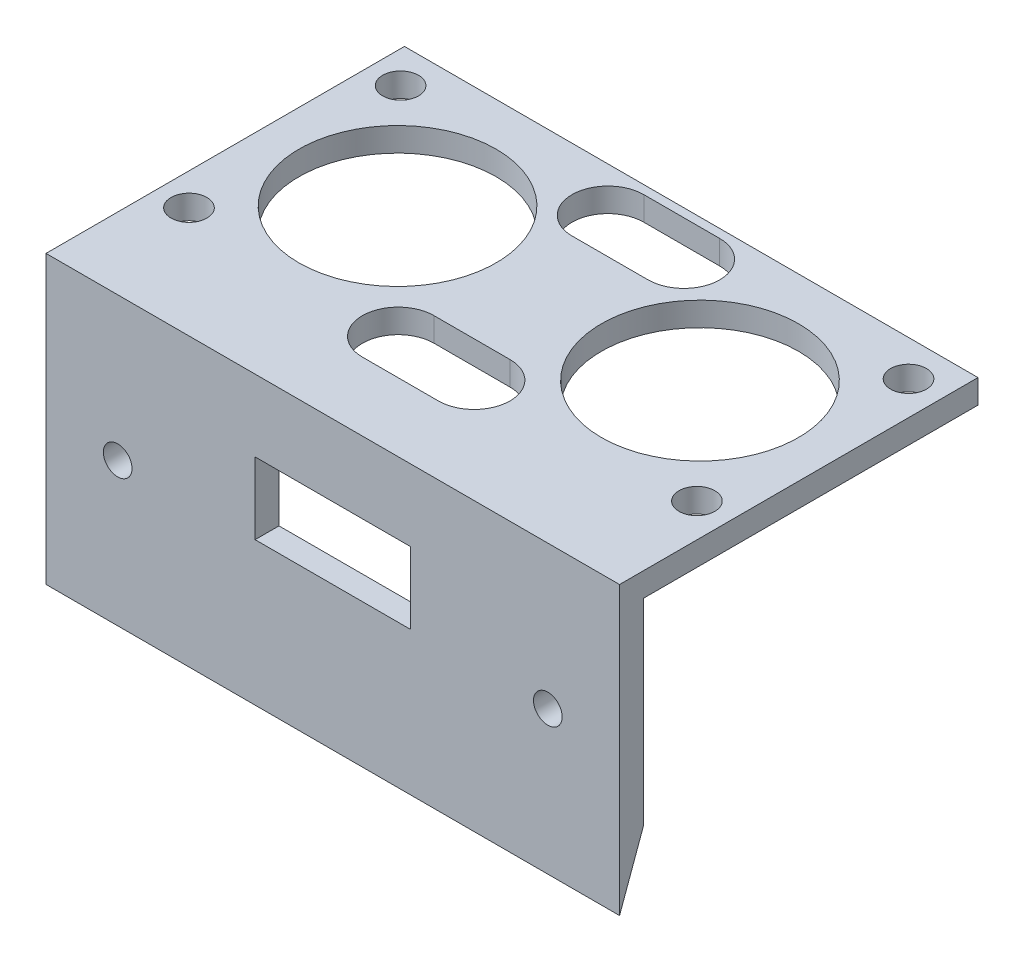
ISO-10303-21;
HEADER;
FILE_DESCRIPTION(('STEP AP214'),'2;1');
FILE_NAME('part.step','',(''),(''),'','','');
FILE_SCHEMA(('AUTOMOTIVE_DESIGN { 1 0 10303 214 1 1 1 1 }'));
ENDSEC;
DATA;
#1=APPLICATION_CONTEXT('core data for automotive mechanical design processes');
#2=APPLICATION_PROTOCOL_DEFINITION('international standard','automotive_design',2000,#1);
#3=PRODUCT_CONTEXT('',#1,'mechanical');
#4=PRODUCT('Part','Part','',(#3));
#5=PRODUCT_RELATED_PRODUCT_CATEGORY('part','',(#4));
#6=PRODUCT_DEFINITION_FORMATION('','',#4);
#7=PRODUCT_DEFINITION_CONTEXT('part definition',#1,'design');
#8=PRODUCT_DEFINITION('design','',#6,#7);
#9=PRODUCT_DEFINITION_SHAPE('','',#8);
#10=(LENGTH_UNIT() NAMED_UNIT(*) SI_UNIT(.MILLI.,.METRE.));
#11=(NAMED_UNIT(*) PLANE_ANGLE_UNIT() SI_UNIT($,.RADIAN.));
#12=(NAMED_UNIT(*) SI_UNIT($,.STERADIAN.) SOLID_ANGLE_UNIT());
#13=UNCERTAINTY_MEASURE_WITH_UNIT(LENGTH_MEASURE(1.E-05),#10,'distance_accuracy_value','');
#14=(GEOMETRIC_REPRESENTATION_CONTEXT(3) GLOBAL_UNCERTAINTY_ASSIGNED_CONTEXT((#13)) GLOBAL_UNIT_ASSIGNED_CONTEXT((#10,
#11,#12)) REPRESENTATION_CONTEXT('',''));
#15=CARTESIAN_POINT('',(0.,0.,0.));
#16=DIRECTION('',(0.,0.,1.));
#17=DIRECTION('',(1.,0.,0.));
#18=AXIS2_PLACEMENT_3D('',#15,#16,#17);
#19=CARTESIAN_POINT('',(42.1597413184278,21.2667271603729,10.8193745932419));
#20=DIRECTION('',(0.,0.,-1.));
#21=DIRECTION('',(-1.,0.,0.));
#22=AXIS2_PLACEMENT_3D('',#19,#20,#21);
#23=PLANE('',#22);
#24=DIRECTION('',(-1.,0.,0.));
#25=VECTOR('',#24,1.);
#26=CARTESIAN_POINT('',(42.1597413184278,23.2667271603729,10.8193745932419));
#27=LINE('',#26,#25);
#28=CARTESIAN_POINT('',(42.1597413184278,23.2667271603729,10.8193745932419));
#29=VERTEX_POINT('',#28);
#30=CARTESIAN_POINT('',(-5.84025868157225,23.2667271603729,10.8193745932419));
#31=VERTEX_POINT('',#30);
#32=EDGE_CURVE('E464',#29,#31,#27,.T.);
#33=ORIENTED_EDGE('',*,*,#32,.F.);
#34=DIRECTION('',(0.,1.,0.));
#35=VECTOR('',#34,1.);
#36=CARTESIAN_POINT('',(42.1597413184278,21.2667271603729,10.8193745932419));
#37=LINE('',#36,#35);
#38=CARTESIAN_POINT('',(42.1597413184278,21.2667271603729,10.8193745932419));
#39=VERTEX_POINT('',#38);
#40=EDGE_CURVE('E496',#39,#29,#37,.T.);
#41=ORIENTED_EDGE('',*,*,#40,.F.);
#42=DIRECTION('',(-1.,0.,0.));
#43=VECTOR('',#42,1.);
#44=CARTESIAN_POINT('',(42.1597413184278,21.2667271603729,10.8193745932419));
#45=LINE('',#44,#43);
#46=CARTESIAN_POINT('',(-5.84025868157225,21.2667271603729,10.8193745932419));
#47=VERTEX_POINT('',#46);
#48=EDGE_CURVE('E474',#39,#47,#45,.T.);
#49=ORIENTED_EDGE('',*,*,#48,.T.);
#50=DIRECTION('',(0.,1.,0.));
#51=VECTOR('',#50,1.);
#52=CARTESIAN_POINT('',(-5.84025868157225,21.2667271603729,10.8193745932419));
#53=LINE('',#52,#51);
#54=EDGE_CURVE('E486',#47,#31,#53,.T.);
#55=ORIENTED_EDGE('',*,*,#54,.T.);
#56=EDGE_LOOP('',(#33,#41,#49,#55));
#57=FACE_BOUND('',#56,.T.);
#58=ADVANCED_FACE('F41',(#57),#23,.T.);
#59=CARTESIAN_POINT('',(42.1597413184278,21.2667271603729,35.8193745932419));
#60=DIRECTION('',(1.,0.,0.));
#61=DIRECTION('',(0.,0.,-1.));
#62=AXIS2_PLACEMENT_3D('',#59,#60,#61);
#63=PLANE('',#62);
#64=DIRECTION('',(0.,-1.,0.));
#65=VECTOR('',#64,1.);
#66=CARTESIAN_POINT('',(42.1597413184278,71.5264412084275,40.8193745932419));
#67=LINE('',#66,#65);
#68=CARTESIAN_POINT('',(42.1597413184278,23.2667271603729,40.8193745932419));
#69=VERTEX_POINT('',#68);
#70=CARTESIAN_POINT('',(42.1597413184278,-0.728227678536239,40.8193745932419));
#71=VERTEX_POINT('',#70);
#72=EDGE_CURVE('E334',#69,#71,#67,.T.);
#73=ORIENTED_EDGE('',*,*,#72,.T.);
#74=DIRECTION('',(0.,-0.939692620785906,0.342020143325675));
#75=VECTOR('',#74,1.);
#76=CARTESIAN_POINT('',(42.1597413184278,20.3007752306342,33.1654434780063));
#77=LINE('',#76,#75);
#78=CARTESIAN_POINT('',(42.1597413184278,4.76672716037289,38.8193745932419));
#79=VERTEX_POINT('',#78);
#80=EDGE_CURVE('E64',#71,#79,#77,.F.);
#81=ORIENTED_EDGE('',*,*,#80,.T.);
#82=DIRECTION('',(0.,1.,0.));
#83=VECTOR('',#82,1.);
#84=CARTESIAN_POINT('',(42.1597413184278,21.2667271603729,38.8193745932419));
#85=LINE('',#84,#83);
#86=CARTESIAN_POINT('',(42.1597413184278,21.2667271603729,38.8193745932419));
#87=VERTEX_POINT('',#86);
#88=EDGE_CURVE('E311',#79,#87,#85,.T.);
#89=ORIENTED_EDGE('',*,*,#88,.T.);
#90=DIRECTION('',(0.,0.,-1.));
#91=VECTOR('',#90,1.);
#92=CARTESIAN_POINT('',(42.1597413184278,21.2667271603729,35.8193745932419));
#93=LINE('',#92,#91);
#94=EDGE_CURVE('E483',#87,#39,#93,.T.);
#95=ORIENTED_EDGE('',*,*,#94,.T.);
#96=ORIENTED_EDGE('',*,*,#40,.T.);
#97=DIRECTION('',(0.,0.,-1.));
#98=VECTOR('',#97,1.);
#99=CARTESIAN_POINT('',(42.1597413184278,23.2667271603729,35.8193745932419));
#100=LINE('',#99,#98);
#101=EDGE_CURVE('E479',#69,#29,#100,.T.);
#102=ORIENTED_EDGE('',*,*,#101,.F.);
#103=EDGE_LOOP('',(#73,#81,#89,#95,#96,#102));
#104=FACE_BOUND('',#103,.T.);
#105=ADVANCED_FACE('F535',(#104),#63,.T.);
#106=CARTESIAN_POINT('',(-5.84025868157225,21.2667271603729,10.8193745932419));
#107=DIRECTION('',(-1.,0.,0.));
#108=DIRECTION('',(0.,0.,1.));
#109=AXIS2_PLACEMENT_3D('',#106,#107,#108);
#110=PLANE('',#109);
#111=DIRECTION('',(0.,-1.,0.));
#112=VECTOR('',#111,1.);
#113=CARTESIAN_POINT('',(-5.84025868157224,21.2667271603729,38.8193745932419));
#114=LINE('',#113,#112);
#115=CARTESIAN_POINT('',(-5.84025868157224,21.2667271603729,38.8193745932419));
#116=VERTEX_POINT('',#115);
#117=CARTESIAN_POINT('',(-5.84025868157223,4.76672716037289,38.8193745932419));
#118=VERTEX_POINT('',#117);
#119=EDGE_CURVE('E321',#116,#118,#114,.T.);
#120=ORIENTED_EDGE('',*,*,#119,.T.);
#121=DIRECTION('',(0.,0.939692620785906,-0.342020143325675));
#122=VECTOR('',#121,1.);
#123=CARTESIAN_POINT('',(-5.84025868157225,28.3356203517161,30.2409990169934));
#124=LINE('',#123,#122);
#125=CARTESIAN_POINT('',(-5.84025868157223,-0.728227678536239,40.8193745932419));
#126=VERTEX_POINT('',#125);
#127=EDGE_CURVE('E11',#118,#126,#124,.F.);
#128=ORIENTED_EDGE('',*,*,#127,.T.);
#129=DIRECTION('',(0.,-1.,0.));
#130=VECTOR('',#129,1.);
#131=CARTESIAN_POINT('',(-5.84025868157223,71.5264412084275,40.8193745932419));
#132=LINE('',#131,#130);
#133=CARTESIAN_POINT('',(-5.84025868157223,23.2667271603729,40.8193745932419));
#134=VERTEX_POINT('',#133);
#135=EDGE_CURVE('E330',#134,#126,#132,.T.);
#136=ORIENTED_EDGE('',*,*,#135,.F.);
#137=DIRECTION('',(0.,0.,1.));
#138=VECTOR('',#137,1.);
#139=CARTESIAN_POINT('',(-5.84025868157225,23.2667271603729,10.8193745932419));
#140=LINE('',#139,#138);
#141=EDGE_CURVE('E490',#31,#134,#140,.T.);
#142=ORIENTED_EDGE('',*,*,#141,.F.);
#143=ORIENTED_EDGE('',*,*,#54,.F.);
#144=DIRECTION('',(0.,0.,1.));
#145=VECTOR('',#144,1.);
#146=CARTESIAN_POINT('',(-5.84025868157225,21.2667271603729,10.8193745932419));
#147=LINE('',#146,#145);
#148=EDGE_CURVE('E478',#47,#116,#147,.T.);
#149=ORIENTED_EDGE('',*,*,#148,.T.);
#150=EDGE_LOOP('',(#120,#128,#136,#142,#143,#149));
#151=FACE_BOUND('',#150,.T.);
#152=ADVANCED_FACE('F523',(#151),#110,.T.);
#153=CARTESIAN_POINT('',(0.,21.2667271603729,0.));
#154=DIRECTION('',(0.,1.,0.));
#155=DIRECTION('',(0.,0.,1.));
#156=AXIS2_PLACEMENT_3D('',#153,#154,#155);
#157=PLANE('',#156);
#158=CARTESIAN_POINT('',(-3.16384489409427,21.2667271603729,31.5293745932419));
#159=DIRECTION('',(0.,1.,0.));
#160=DIRECTION('',(0.,0.,-1.));
#161=AXIS2_PLACEMENT_3D('',#158,#159,#160);
#162=CIRCLE('',#161,1.5);
#163=CARTESIAN_POINT('',(-3.16384489409427,21.2667271603729,30.0293745932419));
#164=VERTEX_POINT('',#163);
#165=EDGE_CURVE('E338',#164,#164,#162,.T.);
#166=ORIENTED_EDGE('',*,*,#165,.T.);
#167=EDGE_LOOP('',(#166));
#168=FACE_BOUND('',#167,.T.);
#169=CARTESIAN_POINT('',(-3.16384489409427,21.2667271603729,13.8193745932419));
#170=DIRECTION('',(0.,1.,0.));
#171=DIRECTION('',(0.,0.,-1.));
#172=AXIS2_PLACEMENT_3D('',#169,#170,#171);
#173=CIRCLE('',#172,1.5);
#174=CARTESIAN_POINT('',(-3.16384489409427,21.2667271603729,12.3193745932419));
#175=VERTEX_POINT('',#174);
#176=EDGE_CURVE('E346',#175,#175,#173,.T.);
#177=ORIENTED_EDGE('',*,*,#176,.T.);
#178=EDGE_LOOP('',(#177));
#179=FACE_BOUND('',#178,.T.);
#180=CARTESIAN_POINT('',(39.3461551059057,21.2667271603729,13.8193745932419));
#181=DIRECTION('',(0.,1.,0.));
#182=DIRECTION('',(0.,0.,-1.));
#183=AXIS2_PLACEMENT_3D('',#180,#181,#182);
#184=CIRCLE('',#183,1.5);
#185=CARTESIAN_POINT('',(39.3461551059057,21.2667271603729,12.3193745932419));
#186=VERTEX_POINT('',#185);
#187=EDGE_CURVE('E354',#186,#186,#184,.T.);
#188=ORIENTED_EDGE('',*,*,#187,.T.);
#189=EDGE_LOOP('',(#188));
#190=FACE_BOUND('',#189,.T.);
#191=CARTESIAN_POINT('',(39.3461551059057,21.2667271603729,31.5293745932419));
#192=DIRECTION('',(0.,1.,0.));
#193=DIRECTION('',(0.,0.,-1.));
#194=AXIS2_PLACEMENT_3D('',#191,#192,#193);
#195=CIRCLE('',#194,1.5);
#196=CARTESIAN_POINT('',(39.3461551059057,21.2667271603729,30.0293745932419));
#197=VERTEX_POINT('',#196);
#198=EDGE_CURVE('E362',#197,#197,#195,.T.);
#199=ORIENTED_EDGE('',*,*,#198,.T.);
#200=EDGE_LOOP('',(#199));
#201=FACE_BOUND('',#200,.T.);
#202=CARTESIAN_POINT('',(30.7461551059057,21.2667271603729,22.6743745932419));
#203=DIRECTION('',(0.,1.,0.));
#204=DIRECTION('',(0.,0.,-1.));
#205=AXIS2_PLACEMENT_3D('',#202,#203,#204);
#206=CIRCLE('',#205,8.25);
#207=CARTESIAN_POINT('',(30.7461551059057,21.2667271603729,14.4243745932419));
#208=VERTEX_POINT('',#207);
#209=EDGE_CURVE('E370',#208,#208,#206,.T.);
#210=ORIENTED_EDGE('',*,*,#209,.T.);
#211=EDGE_LOOP('',(#210));
#212=FACE_BOUND('',#211,.T.);
#213=DIRECTION('',(-1.,0.,0.));
#214=VECTOR('',#213,1.);
#215=CARTESIAN_POINT('',(14.9111551059057,21.2667271603729,11.5443745888145));
#216=LINE('',#215,#214);
#217=CARTESIAN_POINT('',(21.2711551059057,21.2667271603729,11.5443745888145));
#218=VERTEX_POINT('',#217);
#219=CARTESIAN_POINT('',(14.9111551059057,21.2667271603729,11.5443745888145));
#220=VERTEX_POINT('',#219);
#221=EDGE_CURVE('E391',#218,#220,#216,.T.);
#222=ORIENTED_EDGE('',*,*,#221,.T.);
#223=CARTESIAN_POINT('',(14.9111551059057,21.2667271603729,14.5443745888145));
#224=DIRECTION('',(0.,1.,0.));
#225=DIRECTION('',(0.,0.,-1.));
#226=AXIS2_PLACEMENT_3D('',#223,#224,#225);
#227=CIRCLE('',#226,3.);
#228=CARTESIAN_POINT('',(14.9111551059057,21.2667271603729,17.5443745888145));
#229=VERTEX_POINT('',#228);
#230=EDGE_CURVE('E378',#220,#229,#227,.T.);
#231=ORIENTED_EDGE('',*,*,#230,.T.);
#232=DIRECTION('',(1.,0.,0.));
#233=VECTOR('',#232,1.);
#234=CARTESIAN_POINT('',(21.2711551059057,21.2667271603729,17.5443745888145));
#235=LINE('',#234,#233);
#236=CARTESIAN_POINT('',(21.2711551059057,21.2667271603729,17.5443745888145));
#237=VERTEX_POINT('',#236);
#238=EDGE_CURVE('E382',#229,#237,#235,.T.);
#239=ORIENTED_EDGE('',*,*,#238,.T.);
#240=CARTESIAN_POINT('',(21.2711551059057,21.2667271603729,14.5443745888145));
#241=DIRECTION('',(0.,1.,0.));
#242=DIRECTION('',(0.,0.,-1.));
#243=AXIS2_PLACEMENT_3D('',#240,#241,#242);
#244=CIRCLE('',#243,3.);
#245=EDGE_CURVE('E387',#237,#218,#244,.T.);
#246=ORIENTED_EDGE('',*,*,#245,.T.);
#247=EDGE_LOOP('',(#222,#231,#239,#246));
#248=FACE_BOUND('',#247,.T.);
#249=CARTESIAN_POINT('',(5.43615510590573,21.2667271603729,22.6743745932419));
#250=DIRECTION('',(0.,1.,0.));
#251=DIRECTION('',(0.,0.,-1.));
#252=AXIS2_PLACEMENT_3D('',#249,#250,#251);
#253=CIRCLE('',#252,8.25);
#254=CARTESIAN_POINT('',(5.43615510590573,21.2667271603729,14.4243745932419));
#255=VERTEX_POINT('',#254);
#256=EDGE_CURVE('E422',#255,#255,#253,.T.);
#257=ORIENTED_EDGE('',*,*,#256,.T.);
#258=EDGE_LOOP('',(#257));
#259=FACE_BOUND('',#258,.T.);
#260=DIRECTION('',(1.,0.,0.));
#261=VECTOR('',#260,1.);
#262=CARTESIAN_POINT('',(14.9111551059057,21.2667271603729,35.0943745976693));
#263=LINE('',#262,#261);
#264=CARTESIAN_POINT('',(14.9111551059057,21.2667271603729,35.0943745976693));
#265=VERTEX_POINT('',#264);
#266=CARTESIAN_POINT('',(21.2711551059057,21.2667271603729,35.0943745976693));
#267=VERTEX_POINT('',#266);
#268=EDGE_CURVE('E443',#265,#267,#263,.T.);
#269=ORIENTED_EDGE('',*,*,#268,.T.);
#270=CARTESIAN_POINT('',(21.2711551059057,21.2667271603729,32.0943745976693));
#271=DIRECTION('',(0.,1.,0.));
#272=DIRECTION('',(0.,0.,1.));
#273=AXIS2_PLACEMENT_3D('',#270,#271,#272);
#274=CIRCLE('',#273,3.);
#275=CARTESIAN_POINT('',(21.2711551059057,21.2667271603729,29.0943745976693));
#276=VERTEX_POINT('',#275);
#277=EDGE_CURVE('E430',#267,#276,#274,.T.);
#278=ORIENTED_EDGE('',*,*,#277,.T.);
#279=DIRECTION('',(-1.,0.,0.));
#280=VECTOR('',#279,1.);
#281=CARTESIAN_POINT('',(21.2711551059057,21.2667271603729,29.0943745976693));
#282=LINE('',#281,#280);
#283=CARTESIAN_POINT('',(14.9111551059057,21.2667271603729,29.0943745976693));
#284=VERTEX_POINT('',#283);
#285=EDGE_CURVE('E434',#276,#284,#282,.T.);
#286=ORIENTED_EDGE('',*,*,#285,.T.);
#287=CARTESIAN_POINT('',(14.9111551059057,21.2667271603729,32.0943745976693));
#288=DIRECTION('',(0.,1.,0.));
#289=DIRECTION('',(0.,0.,1.));
#290=AXIS2_PLACEMENT_3D('',#287,#288,#289);
#291=CIRCLE('',#290,3.);
#292=EDGE_CURVE('E439',#284,#265,#291,.T.);
#293=ORIENTED_EDGE('',*,*,#292,.T.);
#294=EDGE_LOOP('',(#269,#278,#286,#293));
#295=FACE_BOUND('',#294,.T.);
#296=DIRECTION('',(-1.,0.,0.));
#297=VECTOR('',#296,1.);
#298=CARTESIAN_POINT('',(42.1597413184278,21.2667271603729,38.8193745932419));
#299=LINE('',#298,#297);
#300=CARTESIAN_POINT('',(30.6597413184277,21.2667271603729,38.8193745932419));
#301=VERTEX_POINT('',#300);
#302=CARTESIAN_POINT('',(5.65974131842772,21.2667271603729,38.8193745932419));
#303=VERTEX_POINT('',#302);
#304=EDGE_CURVE('E322',#301,#303,#299,.T.);
#305=ORIENTED_EDGE('',*,*,#304,.T.);
#306=DIRECTION('',(0.,0.,1.));
#307=VECTOR('',#306,1.);
#308=CARTESIAN_POINT('',(5.65974131842772,21.2667271603729,38.8193745932419));
#309=LINE('',#308,#307);
#310=CARTESIAN_POINT('',(5.65974131842772,21.2667271603729,34.8193745932419));
#311=VERTEX_POINT('',#310);
#312=EDGE_CURVE('E273',#311,#303,#309,.T.);
#313=ORIENTED_EDGE('',*,*,#312,.F.);
#314=DIRECTION('',(-1.,0.,0.));
#315=VECTOR('',#314,1.);
#316=CARTESIAN_POINT('',(5.65974131842772,21.2667271603729,34.8193745932419));
#317=LINE('',#316,#315);
#318=CARTESIAN_POINT('',(2.65974131842772,21.2667271603729,34.8193745932419));
#319=VERTEX_POINT('',#318);
#320=EDGE_CURVE('E277',#311,#319,#317,.T.);
#321=ORIENTED_EDGE('',*,*,#320,.T.);
#322=DIRECTION('',(0.,0.,1.));
#323=VECTOR('',#322,1.);
#324=CARTESIAN_POINT('',(2.65974131842772,21.2667271603729,38.8193745932419));
#325=LINE('',#324,#323);
#326=CARTESIAN_POINT('',(2.65974131842772,21.2667271603729,38.8193745932419));
#327=VERTEX_POINT('',#326);
#328=EDGE_CURVE('E263',#319,#327,#325,.T.);
#329=ORIENTED_EDGE('',*,*,#328,.T.);
#330=EDGE_CURVE('E316',#327,#116,#299,.T.);
#331=ORIENTED_EDGE('',*,*,#330,.T.);
#332=ORIENTED_EDGE('',*,*,#148,.F.);
#333=ORIENTED_EDGE('',*,*,#48,.F.);
#334=ORIENTED_EDGE('',*,*,#94,.F.);
#335=CARTESIAN_POINT('',(33.6597413184277,21.2667271603729,38.8193745932419));
#336=VERTEX_POINT('',#335);
#337=EDGE_CURVE('E317',#87,#336,#299,.T.);
#338=ORIENTED_EDGE('',*,*,#337,.T.);
#339=DIRECTION('',(0.,0.,1.));
#340=VECTOR('',#339,1.);
#341=CARTESIAN_POINT('',(33.6597413184277,21.2667271603729,38.8193745932419));
#342=LINE('',#341,#340);
#343=CARTESIAN_POINT('',(33.6597413184277,21.2667271603729,34.8193745932419));
#344=VERTEX_POINT('',#343);
#345=EDGE_CURVE('E288',#344,#336,#342,.T.);
#346=ORIENTED_EDGE('',*,*,#345,.F.);
#347=DIRECTION('',(1.,0.,0.));
#348=VECTOR('',#347,1.);
#349=CARTESIAN_POINT('',(30.6597413184277,21.2667271603729,34.8193745932419));
#350=LINE('',#349,#348);
#351=CARTESIAN_POINT('',(30.6597413184277,21.2667271603729,34.8193745932419));
#352=VERTEX_POINT('',#351);
#353=EDGE_CURVE('E306',#352,#344,#350,.T.);
#354=ORIENTED_EDGE('',*,*,#353,.F.);
#355=DIRECTION('',(0.,0.,1.));
#356=VECTOR('',#355,1.);
#357=CARTESIAN_POINT('',(30.6597413184277,21.2667271603729,38.8193745932419));
#358=LINE('',#357,#356);
#359=EDGE_CURVE('E298',#352,#301,#358,.T.);
#360=ORIENTED_EDGE('',*,*,#359,.T.);
#361=EDGE_LOOP('',(#305,#313,#321,#329,#331,#332,#333,#334,#338,#346,#354,#360));
#362=FACE_BOUND('',#361,.T.);
#363=ADVANCED_FACE('F530',(#168,#179,#190,#201,#212,#248,#259,#295,#362),#157,.F.);
#364=CARTESIAN_POINT('',(0.,23.2667271603729,0.));
#365=DIRECTION('',(0.,1.,0.));
#366=DIRECTION('',(0.,0.,1.));
#367=AXIS2_PLACEMENT_3D('',#364,#365,#366);
#368=PLANE('',#367);
#369=CARTESIAN_POINT('',(-3.16384489409427,23.2667271603729,31.5293745932419));
#370=DIRECTION('',(0.,1.,0.));
#371=DIRECTION('',(0.,0.,-1.));
#372=AXIS2_PLACEMENT_3D('',#369,#370,#371);
#373=CIRCLE('',#372,1.5);
#374=CARTESIAN_POINT('',(-3.16384489409427,23.2667271603729,30.0293745932419));
#375=VERTEX_POINT('',#374);
#376=EDGE_CURVE('E337',#375,#375,#373,.T.);
#377=ORIENTED_EDGE('',*,*,#376,.F.);
#378=EDGE_LOOP('',(#377));
#379=FACE_BOUND('',#378,.T.);
#380=CARTESIAN_POINT('',(-3.16384489409427,23.2667271603729,13.8193745932419));
#381=DIRECTION('',(0.,1.,0.));
#382=DIRECTION('',(0.,0.,-1.));
#383=AXIS2_PLACEMENT_3D('',#380,#381,#382);
#384=CIRCLE('',#383,1.5);
#385=CARTESIAN_POINT('',(-3.16384489409427,23.2667271603729,12.3193745932419));
#386=VERTEX_POINT('',#385);
#387=EDGE_CURVE('E342',#386,#386,#384,.T.);
#388=ORIENTED_EDGE('',*,*,#387,.F.);
#389=EDGE_LOOP('',(#388));
#390=FACE_BOUND('',#389,.T.);
#391=CARTESIAN_POINT('',(39.3461551059057,23.2667271603729,13.8193745932419));
#392=DIRECTION('',(0.,1.,0.));
#393=DIRECTION('',(0.,0.,-1.));
#394=AXIS2_PLACEMENT_3D('',#391,#392,#393);
#395=CIRCLE('',#394,1.5);
#396=CARTESIAN_POINT('',(39.3461551059057,23.2667271603729,12.3193745932419));
#397=VERTEX_POINT('',#396);
#398=EDGE_CURVE('E350',#397,#397,#395,.T.);
#399=ORIENTED_EDGE('',*,*,#398,.F.);
#400=EDGE_LOOP('',(#399));
#401=FACE_BOUND('',#400,.T.);
#402=CARTESIAN_POINT('',(39.3461551059057,23.2667271603729,31.5293745932419));
#403=DIRECTION('',(0.,1.,0.));
#404=DIRECTION('',(0.,0.,-1.));
#405=AXIS2_PLACEMENT_3D('',#402,#403,#404);
#406=CIRCLE('',#405,1.5);
#407=CARTESIAN_POINT('',(39.3461551059057,23.2667271603729,30.0293745932419));
#408=VERTEX_POINT('',#407);
#409=EDGE_CURVE('E358',#408,#408,#406,.T.);
#410=ORIENTED_EDGE('',*,*,#409,.F.);
#411=EDGE_LOOP('',(#410));
#412=FACE_BOUND('',#411,.T.);
#413=CARTESIAN_POINT('',(30.7461551059057,23.2667271603729,22.6743745932419));
#414=DIRECTION('',(0.,1.,0.));
#415=DIRECTION('',(0.,0.,-1.));
#416=AXIS2_PLACEMENT_3D('',#413,#414,#415);
#417=CIRCLE('',#416,8.25);
#418=CARTESIAN_POINT('',(30.7461551059057,23.2667271603729,14.4243745932419));
#419=VERTEX_POINT('',#418);
#420=EDGE_CURVE('E366',#419,#419,#417,.T.);
#421=ORIENTED_EDGE('',*,*,#420,.F.);
#422=EDGE_LOOP('',(#421));
#423=FACE_BOUND('',#422,.T.);
#424=CARTESIAN_POINT('',(14.9111551059057,23.2667271603729,14.5443745888145));
#425=DIRECTION('',(0.,1.,0.));
#426=DIRECTION('',(0.,0.,-1.));
#427=AXIS2_PLACEMENT_3D('',#424,#425,#426);
#428=CIRCLE('',#427,3.);
#429=CARTESIAN_POINT('',(14.9111551059057,23.2667271603729,11.5443745888145));
#430=VERTEX_POINT('',#429);
#431=CARTESIAN_POINT('',(14.9111551059057,23.2667271603729,17.5443745888145));
#432=VERTEX_POINT('',#431);
#433=EDGE_CURVE('E374',#430,#432,#428,.T.);
#434=ORIENTED_EDGE('',*,*,#433,.F.);
#435=DIRECTION('',(-1.,0.,0.));
#436=VECTOR('',#435,1.);
#437=CARTESIAN_POINT('',(14.9111551059057,23.2667271603729,11.5443745888145));
#438=LINE('',#437,#436);
#439=CARTESIAN_POINT('',(21.2711551059057,23.2667271603729,11.5443745888145));
#440=VERTEX_POINT('',#439);
#441=EDGE_CURVE('E383',#440,#430,#438,.T.);
#442=ORIENTED_EDGE('',*,*,#441,.F.);
#443=CARTESIAN_POINT('',(21.2711551059057,23.2667271603729,14.5443745888145));
#444=DIRECTION('',(0.,1.,0.));
#445=DIRECTION('',(0.,0.,-1.));
#446=AXIS2_PLACEMENT_3D('',#443,#444,#445);
#447=CIRCLE('',#446,3.);
#448=CARTESIAN_POINT('',(21.2711551059057,23.2667271603729,17.5443745888145));
#449=VERTEX_POINT('',#448);
#450=EDGE_CURVE('E402',#449,#440,#447,.T.);
#451=ORIENTED_EDGE('',*,*,#450,.F.);
#452=DIRECTION('',(1.,0.,0.));
#453=VECTOR('',#452,1.);
#454=CARTESIAN_POINT('',(21.2711551059057,23.2667271603729,17.5443745888145));
#455=LINE('',#454,#453);
#456=EDGE_CURVE('E398',#432,#449,#455,.T.);
#457=ORIENTED_EDGE('',*,*,#456,.F.);
#458=EDGE_LOOP('',(#434,#442,#451,#457));
#459=FACE_BOUND('',#458,.T.);
#460=CARTESIAN_POINT('',(5.43615510590573,23.2667271603729,22.6743745932419));
#461=DIRECTION('',(0.,1.,0.));
#462=DIRECTION('',(0.,0.,-1.));
#463=AXIS2_PLACEMENT_3D('',#460,#461,#462);
#464=CIRCLE('',#463,8.25);
#465=CARTESIAN_POINT('',(5.43615510590573,23.2667271603729,14.4243745932419));
#466=VERTEX_POINT('',#465);
#467=EDGE_CURVE('E412',#466,#466,#464,.T.);
#468=ORIENTED_EDGE('',*,*,#467,.F.);
#469=EDGE_LOOP('',(#468));
#470=FACE_BOUND('',#469,.T.);
#471=CARTESIAN_POINT('',(21.2711551059057,23.2667271603729,32.0943745976693));
#472=DIRECTION('',(0.,1.,0.));
#473=DIRECTION('',(0.,0.,1.));
#474=AXIS2_PLACEMENT_3D('',#471,#472,#473);
#475=CIRCLE('',#474,3.);
#476=CARTESIAN_POINT('',(21.2711551059057,23.2667271603729,35.0943745976693));
#477=VERTEX_POINT('',#476);
#478=CARTESIAN_POINT('',(21.2711551059057,23.2667271603729,29.0943745976693));
#479=VERTEX_POINT('',#478);
#480=EDGE_CURVE('E426',#477,#479,#475,.T.);
#481=ORIENTED_EDGE('',*,*,#480,.F.);
#482=DIRECTION('',(1.,0.,0.));
#483=VECTOR('',#482,1.);
#484=CARTESIAN_POINT('',(14.9111551059057,23.2667271603729,35.0943745976693));
#485=LINE('',#484,#483);
#486=CARTESIAN_POINT('',(14.9111551059057,23.2667271603729,35.0943745976693));
#487=VERTEX_POINT('',#486);
#488=EDGE_CURVE('E435',#487,#477,#485,.T.);
#489=ORIENTED_EDGE('',*,*,#488,.F.);
#490=CARTESIAN_POINT('',(14.9111551059057,23.2667271603729,32.0943745976693));
#491=DIRECTION('',(0.,1.,0.));
#492=DIRECTION('',(0.,0.,1.));
#493=AXIS2_PLACEMENT_3D('',#490,#491,#492);
#494=CIRCLE('',#493,3.);
#495=CARTESIAN_POINT('',(14.9111551059057,23.2667271603729,29.0943745976693));
#496=VERTEX_POINT('',#495);
#497=EDGE_CURVE('E454',#496,#487,#494,.T.);
#498=ORIENTED_EDGE('',*,*,#497,.F.);
#499=DIRECTION('',(-1.,0.,0.));
#500=VECTOR('',#499,1.);
#501=CARTESIAN_POINT('',(21.2711551059057,23.2667271603729,29.0943745976693));
#502=LINE('',#501,#500);
#503=EDGE_CURVE('E450',#479,#496,#502,.T.);
#504=ORIENTED_EDGE('',*,*,#503,.F.);
#505=EDGE_LOOP('',(#481,#489,#498,#504));
#506=FACE_BOUND('',#505,.T.);
#507=ORIENTED_EDGE('',*,*,#32,.T.);
#508=ORIENTED_EDGE('',*,*,#141,.T.);
#509=DIRECTION('',(-1.,0.,0.));
#510=VECTOR('',#509,1.);
#511=CARTESIAN_POINT('',(42.1597413184278,23.2667271603729,40.8193745932419));
#512=LINE('',#511,#510);
#513=EDGE_CURVE('E326',#69,#134,#512,.T.);
#514=ORIENTED_EDGE('',*,*,#513,.F.);
#515=ORIENTED_EDGE('',*,*,#101,.T.);
#516=EDGE_LOOP('',(#507,#508,#514,#515));
#517=FACE_BOUND('',#516,.T.);
#518=ADVANCED_FACE('F579',(#379,#390,#401,#412,#423,#459,#470,#506,#517),#368,.T.);
#519=CARTESIAN_POINT('',(21.2711551059057,21.2667271603729,32.0943745976693));
#520=DIRECTION('',(0.,1.,0.));
#521=DIRECTION('',(0.,0.,1.));
#522=AXIS2_PLACEMENT_3D('',#519,#520,#521);
#523=CYLINDRICAL_SURFACE('',#522,3.);
#524=ORIENTED_EDGE('',*,*,#480,.T.);
#525=DIRECTION('',(0.,1.,0.));
#526=VECTOR('',#525,1.);
#527=CARTESIAN_POINT('',(21.2711551059057,21.2667271603729,29.0943745976693));
#528=LINE('',#527,#526);
#529=EDGE_CURVE('E447',#276,#479,#528,.T.);
#530=ORIENTED_EDGE('',*,*,#529,.F.);
#531=ORIENTED_EDGE('',*,*,#277,.F.);
#532=DIRECTION('',(0.,1.,0.));
#533=VECTOR('',#532,1.);
#534=CARTESIAN_POINT('',(21.2711551059057,21.2667271603729,35.0943745976693));
#535=LINE('',#534,#533);
#536=EDGE_CURVE('E461',#267,#477,#535,.T.);
#537=ORIENTED_EDGE('',*,*,#536,.T.);
#538=EDGE_LOOP('',(#524,#530,#531,#537));
#539=FACE_BOUND('',#538,.T.);
#540=ADVANCED_FACE('F582',(#539),#523,.F.);
#541=CARTESIAN_POINT('',(14.9111551059057,21.2667271603729,35.0943745976693));
#542=DIRECTION('',(0.,0.,1.));
#543=DIRECTION('',(1.,0.,0.));
#544=AXIS2_PLACEMENT_3D('',#541,#542,#543);
#545=PLANE('',#544);
#546=ORIENTED_EDGE('',*,*,#488,.T.);
#547=ORIENTED_EDGE('',*,*,#536,.F.);
#548=ORIENTED_EDGE('',*,*,#268,.F.);
#549=DIRECTION('',(0.,1.,0.));
#550=VECTOR('',#549,1.);
#551=CARTESIAN_POINT('',(14.9111551059057,21.2667271603729,35.0943745976693));
#552=LINE('',#551,#550);
#553=EDGE_CURVE('E465',#265,#487,#552,.T.);
#554=ORIENTED_EDGE('',*,*,#553,.T.);
#555=EDGE_LOOP('',(#546,#547,#548,#554));
#556=FACE_BOUND('',#555,.T.);
#557=ADVANCED_FACE('F589',(#556),#545,.F.);
#558=CARTESIAN_POINT('',(14.9111551059057,21.2667271603729,32.0943745976693));
#559=DIRECTION('',(0.,1.,0.));
#560=DIRECTION('',(0.,0.,1.));
#561=AXIS2_PLACEMENT_3D('',#558,#559,#560);
#562=CYLINDRICAL_SURFACE('',#561,3.);
#563=ORIENTED_EDGE('',*,*,#497,.T.);
#564=ORIENTED_EDGE('',*,*,#553,.F.);
#565=ORIENTED_EDGE('',*,*,#292,.F.);
#566=DIRECTION('',(0.,1.,0.));
#567=VECTOR('',#566,1.);
#568=CARTESIAN_POINT('',(14.9111551059057,21.2667271603729,29.0943745976693));
#569=LINE('',#568,#567);
#570=EDGE_CURVE('E468',#284,#496,#569,.T.);
#571=ORIENTED_EDGE('',*,*,#570,.T.);
#572=EDGE_LOOP('',(#563,#564,#565,#571));
#573=FACE_BOUND('',#572,.T.);
#574=ADVANCED_FACE('F595',(#573),#562,.F.);
#575=CARTESIAN_POINT('',(21.2711551059057,21.2667271603729,29.0943745976693));
#576=DIRECTION('',(0.,0.,-1.));
#577=DIRECTION('',(-1.,0.,0.));
#578=AXIS2_PLACEMENT_3D('',#575,#576,#577);
#579=PLANE('',#578);
#580=ORIENTED_EDGE('',*,*,#503,.T.);
#581=ORIENTED_EDGE('',*,*,#570,.F.);
#582=ORIENTED_EDGE('',*,*,#285,.F.);
#583=ORIENTED_EDGE('',*,*,#529,.T.);
#584=EDGE_LOOP('',(#580,#581,#582,#583));
#585=FACE_BOUND('',#584,.T.);
#586=ADVANCED_FACE('F591',(#585),#579,.F.);
#587=CARTESIAN_POINT('',(5.43615510590573,21.2667271603729,22.6743745932419));
#588=DIRECTION('',(0.,1.,0.));
#589=DIRECTION('',(0.,0.,1.));
#590=AXIS2_PLACEMENT_3D('',#587,#588,#589);
#591=CYLINDRICAL_SURFACE('',#590,8.25);
#592=ORIENTED_EDGE('',*,*,#256,.F.);
#593=EDGE_LOOP('',(#592));
#594=FACE_BOUND('',#593,.T.);
#595=ORIENTED_EDGE('',*,*,#467,.T.);
#596=EDGE_LOOP('',(#595));
#597=FACE_BOUND('',#596,.T.);
#598=ADVANCED_FACE('F594',(#594,#597),#591,.F.);
#599=CARTESIAN_POINT('',(14.9111551059057,21.2667271603729,14.5443745888145));
#600=DIRECTION('',(0.,1.,0.));
#601=DIRECTION('',(0.,0.,1.));
#602=AXIS2_PLACEMENT_3D('',#599,#600,#601);
#603=CYLINDRICAL_SURFACE('',#602,3.);
#604=ORIENTED_EDGE('',*,*,#433,.T.);
#605=DIRECTION('',(0.,1.,0.));
#606=VECTOR('',#605,1.);
#607=CARTESIAN_POINT('',(14.9111551059057,21.2667271603729,17.5443745888145));
#608=LINE('',#607,#606);
#609=EDGE_CURVE('E395',#229,#432,#608,.T.);
#610=ORIENTED_EDGE('',*,*,#609,.F.);
#611=ORIENTED_EDGE('',*,*,#230,.F.);
#612=DIRECTION('',(0.,1.,0.));
#613=VECTOR('',#612,1.);
#614=CARTESIAN_POINT('',(14.9111551059057,21.2667271603729,11.5443745888145));
#615=LINE('',#614,#613);
#616=EDGE_CURVE('E409',#220,#430,#615,.T.);
#617=ORIENTED_EDGE('',*,*,#616,.T.);
#618=EDGE_LOOP('',(#604,#610,#611,#617));
#619=FACE_BOUND('',#618,.T.);
#620=ADVANCED_FACE('F605',(#619),#603,.F.);
#621=CARTESIAN_POINT('',(14.9111551059057,21.2667271603729,11.5443745888145));
#622=DIRECTION('',(0.,0.,-1.));
#623=DIRECTION('',(-1.,0.,0.));
#624=AXIS2_PLACEMENT_3D('',#621,#622,#623);
#625=PLANE('',#624);
#626=ORIENTED_EDGE('',*,*,#441,.T.);
#627=ORIENTED_EDGE('',*,*,#616,.F.);
#628=ORIENTED_EDGE('',*,*,#221,.F.);
#629=DIRECTION('',(0.,1.,0.));
#630=VECTOR('',#629,1.);
#631=CARTESIAN_POINT('',(21.2711551059057,21.2667271603729,11.5443745888145));
#632=LINE('',#631,#630);
#633=EDGE_CURVE('E413',#218,#440,#632,.T.);
#634=ORIENTED_EDGE('',*,*,#633,.T.);
#635=EDGE_LOOP('',(#626,#627,#628,#634));
#636=FACE_BOUND('',#635,.T.);
#637=ADVANCED_FACE('F609',(#636),#625,.F.);
#638=CARTESIAN_POINT('',(21.2711551059057,21.2667271603729,14.5443745888145));
#639=DIRECTION('',(0.,1.,0.));
#640=DIRECTION('',(0.,0.,1.));
#641=AXIS2_PLACEMENT_3D('',#638,#639,#640);
#642=CYLINDRICAL_SURFACE('',#641,3.);
#643=ORIENTED_EDGE('',*,*,#450,.T.);
#644=ORIENTED_EDGE('',*,*,#633,.F.);
#645=ORIENTED_EDGE('',*,*,#245,.F.);
#646=DIRECTION('',(0.,1.,0.));
#647=VECTOR('',#646,1.);
#648=CARTESIAN_POINT('',(21.2711551059057,21.2667271603729,17.5443745888145));
#649=LINE('',#648,#647);
#650=EDGE_CURVE('E416',#237,#449,#649,.T.);
#651=ORIENTED_EDGE('',*,*,#650,.T.);
#652=EDGE_LOOP('',(#643,#644,#645,#651));
#653=FACE_BOUND('',#652,.T.);
#654=ADVANCED_FACE('F615',(#653),#642,.F.);
#655=CARTESIAN_POINT('',(21.2711551059057,21.2667271603729,17.5443745888145));
#656=DIRECTION('',(0.,0.,1.));
#657=DIRECTION('',(1.,0.,0.));
#658=AXIS2_PLACEMENT_3D('',#655,#656,#657);
#659=PLANE('',#658);
#660=ORIENTED_EDGE('',*,*,#456,.T.);
#661=ORIENTED_EDGE('',*,*,#650,.F.);
#662=ORIENTED_EDGE('',*,*,#238,.F.);
#663=ORIENTED_EDGE('',*,*,#609,.T.);
#664=EDGE_LOOP('',(#660,#661,#662,#663));
#665=FACE_BOUND('',#664,.T.);
#666=ADVANCED_FACE('F611',(#665),#659,.F.);
#667=CARTESIAN_POINT('',(30.7461551059057,21.2667271603729,22.6743745932419));
#668=DIRECTION('',(0.,1.,0.));
#669=DIRECTION('',(0.,0.,1.));
#670=AXIS2_PLACEMENT_3D('',#667,#668,#669);
#671=CYLINDRICAL_SURFACE('',#670,8.25);
#672=ORIENTED_EDGE('',*,*,#209,.F.);
#673=EDGE_LOOP('',(#672));
#674=FACE_BOUND('',#673,.T.);
#675=ORIENTED_EDGE('',*,*,#420,.T.);
#676=EDGE_LOOP('',(#675));
#677=FACE_BOUND('',#676,.T.);
#678=ADVANCED_FACE('F614',(#674,#677),#671,.F.);
#679=CARTESIAN_POINT('',(39.3461551059057,21.2667271603729,31.5293745932419));
#680=DIRECTION('',(0.,1.,0.));
#681=DIRECTION('',(0.,0.,1.));
#682=AXIS2_PLACEMENT_3D('',#679,#680,#681);
#683=CYLINDRICAL_SURFACE('',#682,1.5);
#684=ORIENTED_EDGE('',*,*,#198,.F.);
#685=EDGE_LOOP('',(#684));
#686=FACE_BOUND('',#685,.T.);
#687=ORIENTED_EDGE('',*,*,#409,.T.);
#688=EDGE_LOOP('',(#687));
#689=FACE_BOUND('',#688,.T.);
#690=ADVANCED_FACE('F625',(#686,#689),#683,.F.);
#691=CARTESIAN_POINT('',(39.3461551059057,21.2667271603729,13.8193745932419));
#692=DIRECTION('',(0.,1.,0.));
#693=DIRECTION('',(0.,0.,1.));
#694=AXIS2_PLACEMENT_3D('',#691,#692,#693);
#695=CYLINDRICAL_SURFACE('',#694,1.5);
#696=ORIENTED_EDGE('',*,*,#187,.F.);
#697=EDGE_LOOP('',(#696));
#698=FACE_BOUND('',#697,.T.);
#699=ORIENTED_EDGE('',*,*,#398,.T.);
#700=EDGE_LOOP('',(#699));
#701=FACE_BOUND('',#700,.T.);
#702=ADVANCED_FACE('F629',(#698,#701),#695,.F.);
#703=CARTESIAN_POINT('',(-3.16384489409427,21.2667271603729,13.8193745932419));
#704=DIRECTION('',(0.,1.,0.));
#705=DIRECTION('',(0.,0.,1.));
#706=AXIS2_PLACEMENT_3D('',#703,#704,#705);
#707=CYLINDRICAL_SURFACE('',#706,1.5);
#708=ORIENTED_EDGE('',*,*,#176,.F.);
#709=EDGE_LOOP('',(#708));
#710=FACE_BOUND('',#709,.T.);
#711=ORIENTED_EDGE('',*,*,#387,.T.);
#712=EDGE_LOOP('',(#711));
#713=FACE_BOUND('',#712,.T.);
#714=ADVANCED_FACE('F633',(#710,#713),#707,.F.);
#715=CARTESIAN_POINT('',(-3.16384489409427,21.2667271603729,31.5293745932419));
#716=DIRECTION('',(0.,1.,0.));
#717=DIRECTION('',(0.,0.,1.));
#718=AXIS2_PLACEMENT_3D('',#715,#716,#717);
#719=CYLINDRICAL_SURFACE('',#718,1.5);
#720=ORIENTED_EDGE('',*,*,#165,.F.);
#721=EDGE_LOOP('',(#720));
#722=FACE_BOUND('',#721,.T.);
#723=ORIENTED_EDGE('',*,*,#376,.T.);
#724=EDGE_LOOP('',(#723));
#725=FACE_BOUND('',#724,.T.);
#726=ADVANCED_FACE('F637',(#722,#725),#719,.F.);
#727=CARTESIAN_POINT('',(42.1597413184278,71.5264412084275,40.8193745932419));
#728=DIRECTION('',(0.,0.,1.));
#729=DIRECTION('',(1.,0.,0.));
#730=AXIS2_PLACEMENT_3D('',#727,#728,#729);
#731=PLANE('',#730);
#732=CARTESIAN_POINT('',(36.1597413184278,11.2667271603729,40.8193745932419));
#733=DIRECTION('',(0.,0.,-1.));
#734=DIRECTION('',(-1.,0.,0.));
#735=AXIS2_PLACEMENT_3D('',#732,#733,#734);
#736=CIRCLE('',#735,1.2);
#737=CARTESIAN_POINT('',(34.9597413184278,11.2667271603729,40.8193745932419));
#738=VERTEX_POINT('',#737);
#739=EDGE_CURVE('E233',#738,#738,#736,.T.);
#740=ORIENTED_EDGE('',*,*,#739,.T.);
#741=EDGE_LOOP('',(#740));
#742=FACE_BOUND('',#741,.T.);
#743=CARTESIAN_POINT('',(0.159741318427747,11.2667271603729,40.8193745932419));
#744=DIRECTION('',(0.,0.,-1.));
#745=DIRECTION('',(1.,0.,0.));
#746=AXIS2_PLACEMENT_3D('',#743,#744,#745);
#747=CIRCLE('',#746,1.2);
#748=CARTESIAN_POINT('',(1.35974131842775,11.2667271603729,40.8193745932419));
#749=VERTEX_POINT('',#748);
#750=EDGE_CURVE('E900',#749,#749,#747,.T.);
#751=ORIENTED_EDGE('',*,*,#750,.T.);
#752=EDGE_LOOP('',(#751));
#753=FACE_BOUND('',#752,.T.);
#754=DIRECTION('',(0.,1.,0.));
#755=VECTOR('',#754,1.);
#756=CARTESIAN_POINT('',(11.6597413184277,11.2667271603729,40.8193745932419));
#757=LINE('',#756,#755);
#758=CARTESIAN_POINT('',(11.6597413184277,11.2667271603729,40.8193745932419));
#759=VERTEX_POINT('',#758);
#760=CARTESIAN_POINT('',(11.6597413184277,17.2667271603729,40.8193745932419));
#761=VERTEX_POINT('',#760);
#762=EDGE_CURVE('E209',#759,#761,#757,.T.);
#763=ORIENTED_EDGE('',*,*,#762,.T.);
#764=DIRECTION('',(1.,0.,0.));
#765=VECTOR('',#764,1.);
#766=CARTESIAN_POINT('',(24.6597413184277,17.2667271603729,40.8193745932419));
#767=LINE('',#766,#765);
#768=CARTESIAN_POINT('',(24.6597413184277,17.2667271603729,40.8193745932419));
#769=VERTEX_POINT('',#768);
#770=EDGE_CURVE('E221',#761,#769,#767,.T.);
#771=ORIENTED_EDGE('',*,*,#770,.T.);
#772=DIRECTION('',(0.,-1.,0.));
#773=VECTOR('',#772,1.);
#774=CARTESIAN_POINT('',(24.6597413184277,11.2667271603729,40.8193745932419));
#775=LINE('',#774,#773);
#776=CARTESIAN_POINT('',(24.6597413184277,11.2667271603729,40.8193745932419));
#777=VERTEX_POINT('',#776);
#778=EDGE_CURVE('E227',#769,#777,#775,.T.);
#779=ORIENTED_EDGE('',*,*,#778,.T.);
#780=DIRECTION('',(-1.,0.,0.));
#781=VECTOR('',#780,1.);
#782=CARTESIAN_POINT('',(24.6597413184277,11.2667271603729,40.8193745932419));
#783=LINE('',#782,#781);
#784=EDGE_CURVE('E217',#777,#759,#783,.T.);
#785=ORIENTED_EDGE('',*,*,#784,.T.);
#786=EDGE_LOOP('',(#763,#771,#779,#785));
#787=FACE_BOUND('',#786,.T.);
#788=ORIENTED_EDGE('',*,*,#135,.T.);
#789=DIRECTION('',(-1.,0.,0.));
#790=VECTOR('',#789,1.);
#791=CARTESIAN_POINT('',(42.1597413184278,-0.728227678536239,40.8193745932419));
#792=LINE('',#791,#790);
#793=EDGE_CURVE('E512',#126,#71,#792,.F.);
#794=ORIENTED_EDGE('',*,*,#793,.T.);
#795=ORIENTED_EDGE('',*,*,#72,.F.);
#796=ORIENTED_EDGE('',*,*,#513,.T.);
#797=EDGE_LOOP('',(#788,#794,#795,#796));
#798=FACE_BOUND('',#797,.T.);
#799=ADVANCED_FACE('F229',(#742,#753,#787,#798),#731,.T.);
#800=CARTESIAN_POINT('',(0.,0.,38.8193745932419));
#801=DIRECTION('',(0.,0.,-1.));
#802=DIRECTION('',(-1.,0.,0.));
#803=AXIS2_PLACEMENT_3D('',#800,#801,#802);
#804=PLANE('',#803);
#805=CARTESIAN_POINT('',(36.1597413184278,11.2667271603729,38.8193745932419));
#806=DIRECTION('',(0.,0.,-1.));
#807=DIRECTION('',(-1.,0.,0.));
#808=AXIS2_PLACEMENT_3D('',#805,#806,#807);
#809=CIRCLE('',#808,1.2);
#810=CARTESIAN_POINT('',(34.9597413184278,11.2667271603729,38.8193745932419));
#811=VERTEX_POINT('',#810);
#812=EDGE_CURVE('E237',#811,#811,#809,.T.);
#813=ORIENTED_EDGE('',*,*,#812,.F.);
#814=EDGE_LOOP('',(#813));
#815=FACE_BOUND('',#814,.T.);
#816=CARTESIAN_POINT('',(0.159741318427747,11.2667271603729,38.8193745932419));
#817=DIRECTION('',(0.,0.,-1.));
#818=DIRECTION('',(1.,0.,0.));
#819=AXIS2_PLACEMENT_3D('',#816,#817,#818);
#820=CIRCLE('',#819,1.2);
#821=CARTESIAN_POINT('',(1.35974131842775,11.2667271603729,38.8193745932419));
#822=VERTEX_POINT('',#821);
#823=EDGE_CURVE('E240',#822,#822,#820,.T.);
#824=ORIENTED_EDGE('',*,*,#823,.F.);
#825=EDGE_LOOP('',(#824));
#826=FACE_BOUND('',#825,.T.);
#827=DIRECTION('',(0.,1.,0.));
#828=VECTOR('',#827,1.);
#829=CARTESIAN_POINT('',(11.6597413184277,0.,38.8193745932419));
#830=LINE('',#829,#828);
#831=CARTESIAN_POINT('',(11.6597413184277,11.2667271603729,38.8193745932419));
#832=VERTEX_POINT('',#831);
#833=CARTESIAN_POINT('',(11.6597413184277,17.2667271603729,38.8193745932419));
#834=VERTEX_POINT('',#833);
#835=EDGE_CURVE('E212',#832,#834,#830,.T.);
#836=ORIENTED_EDGE('',*,*,#835,.F.);
#837=DIRECTION('',(-1.,0.,0.));
#838=VECTOR('',#837,1.);
#839=CARTESIAN_POINT('',(0.,11.2667271603729,38.8193745932419));
#840=LINE('',#839,#838);
#841=CARTESIAN_POINT('',(24.6597413184277,11.2667271603729,38.8193745932419));
#842=VERTEX_POINT('',#841);
#843=EDGE_CURVE('E507',#842,#832,#840,.T.);
#844=ORIENTED_EDGE('',*,*,#843,.F.);
#845=DIRECTION('',(0.,-1.,0.));
#846=VECTOR('',#845,1.);
#847=CARTESIAN_POINT('',(24.6597413184277,0.,38.8193745932419));
#848=LINE('',#847,#846);
#849=CARTESIAN_POINT('',(24.6597413184277,17.2667271603729,38.8193745932419));
#850=VERTEX_POINT('',#849);
#851=EDGE_CURVE('E504',#850,#842,#848,.T.);
#852=ORIENTED_EDGE('',*,*,#851,.F.);
#853=DIRECTION('',(1.,0.,0.));
#854=VECTOR('',#853,1.);
#855=CARTESIAN_POINT('',(0.,17.2667271603729,38.8193745932419));
#856=LINE('',#855,#854);
#857=EDGE_CURVE('E499',#834,#850,#856,.T.);
#858=ORIENTED_EDGE('',*,*,#857,.F.);
#859=EDGE_LOOP('',(#836,#844,#852,#858));
#860=FACE_BOUND('',#859,.T.);
#861=ORIENTED_EDGE('',*,*,#88,.F.);
#862=DIRECTION('',(-1.,0.,0.));
#863=VECTOR('',#862,1.);
#864=CARTESIAN_POINT('',(0.,4.76672716037289,38.8193745932419));
#865=LINE('',#864,#863);
#866=EDGE_CURVE('E51',#79,#118,#865,.T.);
#867=ORIENTED_EDGE('',*,*,#866,.T.);
#868=ORIENTED_EDGE('',*,*,#119,.F.);
#869=ORIENTED_EDGE('',*,*,#330,.F.);
#870=DIRECTION('',(0.,-1.,0.));
#871=VECTOR('',#870,1.);
#872=CARTESIAN_POINT('',(2.65974131842772,17.2667271603729,38.8193745932419));
#873=LINE('',#872,#871);
#874=CARTESIAN_POINT('',(2.65974131842772,17.2667271603729,38.8193745932419));
#875=VERTEX_POINT('',#874);
#876=EDGE_CURVE('E259',#327,#875,#873,.T.);
#877=ORIENTED_EDGE('',*,*,#876,.T.);
#878=DIRECTION('',(-1.,0.,0.));
#879=VECTOR('',#878,1.);
#880=CARTESIAN_POINT('',(5.65974131842772,17.2667271603729,38.8193745932419));
#881=LINE('',#880,#879);
#882=CARTESIAN_POINT('',(5.65974131842772,17.2667271603729,38.8193745932419));
#883=VERTEX_POINT('',#882);
#884=EDGE_CURVE('E276',#883,#875,#881,.T.);
#885=ORIENTED_EDGE('',*,*,#884,.F.);
#886=DIRECTION('',(0.,-1.,0.));
#887=VECTOR('',#886,1.);
#888=CARTESIAN_POINT('',(5.65974131842772,17.2667271603729,38.8193745932419));
#889=LINE('',#888,#887);
#890=EDGE_CURVE('E270',#303,#883,#889,.T.);
#891=ORIENTED_EDGE('',*,*,#890,.F.);
#892=ORIENTED_EDGE('',*,*,#304,.F.);
#893=DIRECTION('',(0.,-1.,0.));
#894=VECTOR('',#893,1.);
#895=CARTESIAN_POINT('',(30.6597413184277,17.2667271603729,38.8193745932419));
#896=LINE('',#895,#894);
#897=CARTESIAN_POINT('',(30.6597413184277,17.2667271603729,38.8193745932419));
#898=VERTEX_POINT('',#897);
#899=EDGE_CURVE('E302',#301,#898,#896,.T.);
#900=ORIENTED_EDGE('',*,*,#899,.T.);
#901=DIRECTION('',(1.,0.,0.));
#902=VECTOR('',#901,1.);
#903=CARTESIAN_POINT('',(30.6597413184277,17.2667271603729,38.8193745932419));
#904=LINE('',#903,#902);
#905=CARTESIAN_POINT('',(33.6597413184277,17.2667271603729,38.8193745932419));
#906=VERTEX_POINT('',#905);
#907=EDGE_CURVE('E307',#898,#906,#904,.T.);
#908=ORIENTED_EDGE('',*,*,#907,.T.);
#909=DIRECTION('',(0.,-1.,0.));
#910=VECTOR('',#909,1.);
#911=CARTESIAN_POINT('',(33.6597413184277,17.2667271603729,38.8193745932419));
#912=LINE('',#911,#910);
#913=EDGE_CURVE('E291',#336,#906,#912,.T.);
#914=ORIENTED_EDGE('',*,*,#913,.F.);
#915=ORIENTED_EDGE('',*,*,#337,.F.);
#916=EDGE_LOOP('',(#861,#867,#868,#869,#877,#885,#891,#892,#900,#908,#914,#915));
#917=FACE_BOUND('',#916,.T.);
#918=ADVANCED_FACE('F519',(#815,#826,#860,#917),#804,.T.);
#919=CARTESIAN_POINT('',(30.6597413184277,21.2667271603729,34.8193745932419));
#920=DIRECTION('',(0.,-0.707106781186547,-0.707106781186548));
#921=DIRECTION('',(0.,0.707106781186548,-0.707106781186547));
#922=AXIS2_PLACEMENT_3D('',#919,#920,#921);
#923=PLANE('',#922);
#924=ORIENTED_EDGE('',*,*,#353,.T.);
#925=DIRECTION('',(0.,0.707106781186548,-0.707106781186547));
#926=VECTOR('',#925,1.);
#927=CARTESIAN_POINT('',(33.6597413184277,21.2667271603729,34.8193745932419));
#928=LINE('',#927,#926);
#929=EDGE_CURVE('E281',#906,#344,#928,.T.);
#930=ORIENTED_EDGE('',*,*,#929,.F.);
#931=ORIENTED_EDGE('',*,*,#907,.F.);
#932=DIRECTION('',(0.,0.707106781186548,-0.707106781186547));
#933=VECTOR('',#932,1.);
#934=CARTESIAN_POINT('',(30.6597413184277,21.2667271603729,34.8193745932419));
#935=LINE('',#934,#933);
#936=EDGE_CURVE('E294',#898,#352,#935,.T.);
#937=ORIENTED_EDGE('',*,*,#936,.T.);
#938=EDGE_LOOP('',(#924,#930,#931,#937));
#939=FACE_BOUND('',#938,.T.);
#940=ADVANCED_FACE('F544',(#939),#923,.T.);
#941=CARTESIAN_POINT('',(30.6597413184278,0.,0.));
#942=DIRECTION('',(-1.,0.,0.));
#943=DIRECTION('',(0.,0.,1.));
#944=AXIS2_PLACEMENT_3D('',#941,#942,#943);
#945=PLANE('',#944);
#946=ORIENTED_EDGE('',*,*,#936,.F.);
#947=ORIENTED_EDGE('',*,*,#899,.F.);
#948=ORIENTED_EDGE('',*,*,#359,.F.);
#949=EDGE_LOOP('',(#946,#947,#948));
#950=FACE_BOUND('',#949,.T.);
#951=ADVANCED_FACE('F650',(#950),#945,.T.);
#952=CARTESIAN_POINT('',(33.6597413184278,0.,0.));
#953=DIRECTION('',(-1.,0.,0.));
#954=DIRECTION('',(0.,0.,1.));
#955=AXIS2_PLACEMENT_3D('',#952,#953,#954);
#956=PLANE('',#955);
#957=ORIENTED_EDGE('',*,*,#929,.T.);
#958=ORIENTED_EDGE('',*,*,#345,.T.);
#959=ORIENTED_EDGE('',*,*,#913,.T.);
#960=EDGE_LOOP('',(#957,#958,#959));
#961=FACE_BOUND('',#960,.T.);
#962=ADVANCED_FACE('F542',(#961),#956,.F.);
#963=CARTESIAN_POINT('',(5.65974131842772,21.2667271603729,34.8193745932419));
#964=DIRECTION('',(0.,0.707106781186547,0.707106781186548));
#965=DIRECTION('',(0.,-0.707106781186548,0.707106781186547));
#966=AXIS2_PLACEMENT_3D('',#963,#964,#965);
#967=PLANE('',#966);
#968=ORIENTED_EDGE('',*,*,#884,.T.);
#969=DIRECTION('',(0.,0.707106781186548,-0.707106781186547));
#970=VECTOR('',#969,1.);
#971=CARTESIAN_POINT('',(2.65974131842772,21.2667271603729,34.8193745932419));
#972=LINE('',#971,#970);
#973=EDGE_CURVE('E250',#875,#319,#972,.T.);
#974=ORIENTED_EDGE('',*,*,#973,.T.);
#975=ORIENTED_EDGE('',*,*,#320,.F.);
#976=DIRECTION('',(0.,0.707106781186548,-0.707106781186547));
#977=VECTOR('',#976,1.);
#978=CARTESIAN_POINT('',(5.65974131842772,21.2667271603729,34.8193745932419));
#979=LINE('',#978,#977);
#980=EDGE_CURVE('E267',#883,#311,#979,.T.);
#981=ORIENTED_EDGE('',*,*,#980,.F.);
#982=EDGE_LOOP('',(#968,#974,#975,#981));
#983=FACE_BOUND('',#982,.T.);
#984=ADVANCED_FACE('F558',(#983),#967,.F.);
#985=CARTESIAN_POINT('',(5.6597413184277,0.,0.));
#986=DIRECTION('',(1.,0.,0.));
#987=DIRECTION('',(0.,0.,1.));
#988=AXIS2_PLACEMENT_3D('',#985,#986,#987);
#989=PLANE('',#988);
#990=ORIENTED_EDGE('',*,*,#980,.T.);
#991=ORIENTED_EDGE('',*,*,#312,.T.);
#992=ORIENTED_EDGE('',*,*,#890,.T.);
#993=EDGE_LOOP('',(#990,#991,#992));
#994=FACE_BOUND('',#993,.T.);
#995=ADVANCED_FACE('F555',(#994),#989,.T.);
#996=CARTESIAN_POINT('',(2.6597413184277,0.,0.));
#997=DIRECTION('',(1.,0.,0.));
#998=DIRECTION('',(0.,0.,1.));
#999=AXIS2_PLACEMENT_3D('',#996,#997,#998);
#1000=PLANE('',#999);
#1001=ORIENTED_EDGE('',*,*,#973,.F.);
#1002=ORIENTED_EDGE('',*,*,#876,.F.);
#1003=ORIENTED_EDGE('',*,*,#328,.F.);
#1004=EDGE_LOOP('',(#1001,#1002,#1003));
#1005=FACE_BOUND('',#1004,.T.);
#1006=ADVANCED_FACE('F561',(#1005),#1000,.F.);
#1007=CARTESIAN_POINT('',(11.6597413184277,11.2667271603729,40.8193745932419));
#1008=DIRECTION('',(-1.,0.,0.));
#1009=DIRECTION('',(0.,0.,1.));
#1010=AXIS2_PLACEMENT_3D('',#1007,#1008,#1009);
#1011=PLANE('',#1010);
#1012=ORIENTED_EDGE('',*,*,#835,.T.);
#1013=DIRECTION('',(0.,0.,-1.));
#1014=VECTOR('',#1013,1.);
#1015=CARTESIAN_POINT('',(11.6597413184277,17.2667271603729,40.8193745932419));
#1016=LINE('',#1015,#1014);
#1017=EDGE_CURVE('E204',#761,#834,#1016,.T.);
#1018=ORIENTED_EDGE('',*,*,#1017,.F.);
#1019=ORIENTED_EDGE('',*,*,#762,.F.);
#1020=DIRECTION('',(0.,0.,-1.));
#1021=VECTOR('',#1020,1.);
#1022=CARTESIAN_POINT('',(11.6597413184277,11.2667271603729,40.8193745932419));
#1023=LINE('',#1022,#1021);
#1024=EDGE_CURVE('E247',#759,#832,#1023,.T.);
#1025=ORIENTED_EDGE('',*,*,#1024,.T.);
#1026=EDGE_LOOP('',(#1012,#1018,#1019,#1025));
#1027=FACE_BOUND('',#1026,.T.);
#1028=ADVANCED_FACE('F206',(#1027),#1011,.F.);
#1029=CARTESIAN_POINT('',(24.6597413184277,11.2667271603729,40.8193745932419));
#1030=DIRECTION('',(0.,-1.,0.));
#1031=DIRECTION('',(0.,0.,-1.));
#1032=AXIS2_PLACEMENT_3D('',#1029,#1030,#1031);
#1033=PLANE('',#1032);
#1034=ORIENTED_EDGE('',*,*,#843,.T.);
#1035=ORIENTED_EDGE('',*,*,#1024,.F.);
#1036=ORIENTED_EDGE('',*,*,#784,.F.);
#1037=DIRECTION('',(0.,0.,-1.));
#1038=VECTOR('',#1037,1.);
#1039=CARTESIAN_POINT('',(24.6597413184277,11.2667271603729,40.8193745932419));
#1040=LINE('',#1039,#1038);
#1041=EDGE_CURVE('E251',#777,#842,#1040,.T.);
#1042=ORIENTED_EDGE('',*,*,#1041,.T.);
#1043=EDGE_LOOP('',(#1034,#1035,#1036,#1042));
#1044=FACE_BOUND('',#1043,.T.);
#1045=ADVANCED_FACE('F568',(#1044),#1033,.F.);
#1046=CARTESIAN_POINT('',(24.6597413184277,11.2667271603729,40.8193745932419));
#1047=DIRECTION('',(1.,0.,0.));
#1048=DIRECTION('',(0.,0.,-1.));
#1049=AXIS2_PLACEMENT_3D('',#1046,#1047,#1048);
#1050=PLANE('',#1049);
#1051=ORIENTED_EDGE('',*,*,#851,.T.);
#1052=ORIENTED_EDGE('',*,*,#1041,.F.);
#1053=ORIENTED_EDGE('',*,*,#778,.F.);
#1054=DIRECTION('',(0.,0.,-1.));
#1055=VECTOR('',#1054,1.);
#1056=CARTESIAN_POINT('',(24.6597413184277,17.2667271603729,40.8193745932419));
#1057=LINE('',#1056,#1055);
#1058=EDGE_CURVE('E216',#769,#850,#1057,.T.);
#1059=ORIENTED_EDGE('',*,*,#1058,.T.);
#1060=EDGE_LOOP('',(#1051,#1052,#1053,#1059));
#1061=FACE_BOUND('',#1060,.T.);
#1062=ADVANCED_FACE('F684',(#1061),#1050,.F.);
#1063=CARTESIAN_POINT('',(24.6597413184277,17.2667271603729,40.8193745932419));
#1064=DIRECTION('',(0.,1.,0.));
#1065=DIRECTION('',(0.,0.,1.));
#1066=AXIS2_PLACEMENT_3D('',#1063,#1064,#1065);
#1067=PLANE('',#1066);
#1068=ORIENTED_EDGE('',*,*,#857,.T.);
#1069=ORIENTED_EDGE('',*,*,#1058,.F.);
#1070=ORIENTED_EDGE('',*,*,#770,.F.);
#1071=ORIENTED_EDGE('',*,*,#1017,.T.);
#1072=EDGE_LOOP('',(#1068,#1069,#1070,#1071));
#1073=FACE_BOUND('',#1072,.T.);
#1074=ADVANCED_FACE('F222',(#1073),#1067,.F.);
#1075=CARTESIAN_POINT('',(0.159741318427747,11.2667271603729,40.8193745932419));
#1076=DIRECTION('',(0.,0.,-1.));
#1077=DIRECTION('',(-1.,0.,0.));
#1078=AXIS2_PLACEMENT_3D('',#1075,#1076,#1077);
#1079=CYLINDRICAL_SURFACE('',#1078,1.2);
#1080=ORIENTED_EDGE('',*,*,#750,.F.);
#1081=EDGE_LOOP('',(#1080));
#1082=FACE_BOUND('',#1081,.T.);
#1083=ORIENTED_EDGE('',*,*,#823,.T.);
#1084=EDGE_LOOP('',(#1083));
#1085=FACE_BOUND('',#1084,.T.);
#1086=ADVANCED_FACE('F703',(#1082,#1085),#1079,.F.);
#1087=CARTESIAN_POINT('',(36.1597413184278,11.2667271603729,40.8193745932419));
#1088=DIRECTION('',(0.,0.,-1.));
#1089=DIRECTION('',(-1.,0.,0.));
#1090=AXIS2_PLACEMENT_3D('',#1087,#1088,#1089);
#1091=CYLINDRICAL_SURFACE('',#1090,1.2);
#1092=ORIENTED_EDGE('',*,*,#739,.F.);
#1093=EDGE_LOOP('',(#1092));
#1094=FACE_BOUND('',#1093,.T.);
#1095=ORIENTED_EDGE('',*,*,#812,.T.);
#1096=EDGE_LOOP('',(#1095));
#1097=FACE_BOUND('',#1096,.T.);
#1098=ADVANCED_FACE('F712',(#1094,#1097),#1091,.F.);
#1099=CARTESIAN_POINT('',(42.1597413184278,-0.733272839627123,40.8212108817061));
#1100=DIRECTION('',(0.,0.342020143325675,0.939692620785906));
#1101=DIRECTION('',(1.,0.,0.));
#1102=AXIS2_PLACEMENT_3D('',#1099,#1100,#1101);
#1103=PLANE('',#1102);
#1104=ORIENTED_EDGE('',*,*,#127,.F.);
#1105=ORIENTED_EDGE('',*,*,#866,.F.);
#1106=ORIENTED_EDGE('',*,*,#80,.F.);
#1107=ORIENTED_EDGE('',*,*,#793,.F.);
#1108=EDGE_LOOP('',(#1104,#1105,#1106,#1107));
#1109=FACE_BOUND('',#1108,.T.);
#1110=ADVANCED_FACE('F44',(#1109),#1103,.F.);
#1111=CLOSED_SHELL('',(#58,#105,#152,#363,#518,#540,#557,#574,#586,#598,#620,#637,#654,#666,
#678,#690,#702,#714,#726,#799,#918,#940,#951,#962,#984,#995,#1006,#1028,#1045,#1062,#1074,#1086,
#1098,#1110));
#1112=MANIFOLD_SOLID_BREP('B2',#1111);
#1113=ADVANCED_BREP_SHAPE_REPRESENTATION('',(#18,#1112),#14);
#1114=SHAPE_DEFINITION_REPRESENTATION(#9,#1113);
ENDSEC;
END-ISO-10303-21;
